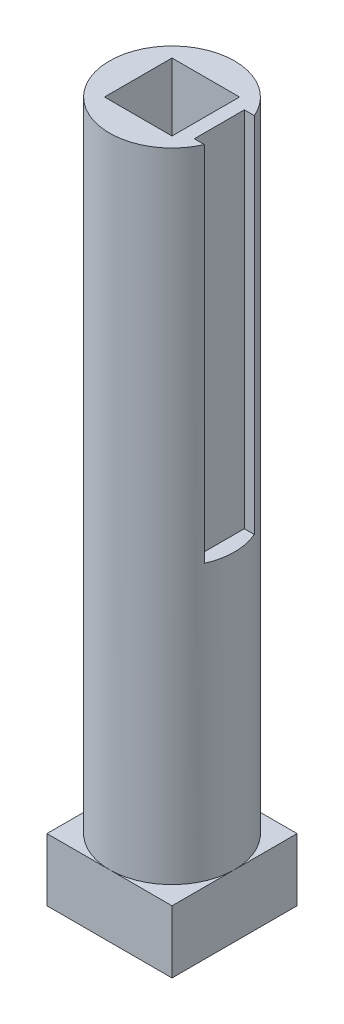
ISO-10303-21;
HEADER;
FILE_DESCRIPTION(('STEP AP214'),'2;1');
FILE_NAME('part.step','',(''),(''),'','','');
FILE_SCHEMA(('AUTOMOTIVE_DESIGN { 1 0 10303 214 1 1 1 1 }'));
ENDSEC;
DATA;
#1=APPLICATION_CONTEXT('core data for automotive mechanical design processes');
#2=APPLICATION_PROTOCOL_DEFINITION('international standard','automotive_design',2000,#1);
#3=PRODUCT_CONTEXT('',#1,'mechanical');
#4=PRODUCT('Part','Part','',(#3));
#5=PRODUCT_RELATED_PRODUCT_CATEGORY('part','',(#4));
#6=PRODUCT_DEFINITION_FORMATION('','',#4);
#7=PRODUCT_DEFINITION_CONTEXT('part definition',#1,'design');
#8=PRODUCT_DEFINITION('design','',#6,#7);
#9=PRODUCT_DEFINITION_SHAPE('','',#8);
#10=(LENGTH_UNIT() NAMED_UNIT(*) SI_UNIT(.MILLI.,.METRE.));
#11=(NAMED_UNIT(*) PLANE_ANGLE_UNIT() SI_UNIT($,.RADIAN.));
#12=(NAMED_UNIT(*) SI_UNIT($,.STERADIAN.) SOLID_ANGLE_UNIT());
#13=UNCERTAINTY_MEASURE_WITH_UNIT(LENGTH_MEASURE(1.E-05),#10,'distance_accuracy_value','');
#14=(GEOMETRIC_REPRESENTATION_CONTEXT(3) GLOBAL_UNCERTAINTY_ASSIGNED_CONTEXT((#13)) GLOBAL_UNIT_ASSIGNED_CONTEXT((#10,
#11,#12)) REPRESENTATION_CONTEXT('',''));
#15=CARTESIAN_POINT('',(0.,0.,0.));
#16=DIRECTION('',(0.,0.,1.));
#17=DIRECTION('',(1.,0.,0.));
#18=AXIS2_PLACEMENT_3D('',#15,#16,#17);
#19=CARTESIAN_POINT('',(-4.61642628509379,2.24309980317992,14.5677396821385));
#20=DIRECTION('',(0.,-1.,0.));
#21=DIRECTION('',(0.,0.,-1.));
#22=AXIS2_PLACEMENT_3D('',#19,#20,#21);
#23=CYLINDRICAL_SURFACE('',#22,2.5);
#24=CARTESIAN_POINT('',(-4.61642628509379,-15.3569001968201,14.5677396821385));
#25=DIRECTION('',(0.,1.,0.));
#26=DIRECTION('',(0.,0.,1.));
#27=AXIS2_PLACEMENT_3D('',#24,#25,#26);
#28=CIRCLE('',#27,2.5);
#29=CARTESIAN_POINT('',(-4.61642628509379,-15.3569001968201,17.0677396821385));
#30=VERTEX_POINT('',#29);
#31=CARTESIAN_POINT('',(-2.11642628509379,-15.3569001968201,14.5677396821385));
#32=VERTEX_POINT('',#31);
#33=EDGE_CURVE('E52',#30,#32,#28,.T.);
#34=ORIENTED_EDGE('',*,*,#33,.T.);
#35=CARTESIAN_POINT('',(-4.61642628509379,-15.3569001968201,12.0677396821385));
#36=VERTEX_POINT('',#35);
#37=EDGE_CURVE('E11',#32,#36,#28,.T.);
#38=ORIENTED_EDGE('',*,*,#37,.T.);
#39=CARTESIAN_POINT('',(-7.11642628509379,-15.3569001968201,14.5677396821385));
#40=VERTEX_POINT('',#39);
#41=EDGE_CURVE('E50',#36,#40,#28,.T.);
#42=ORIENTED_EDGE('',*,*,#41,.T.);
#43=EDGE_CURVE('E214',#40,#30,#28,.T.);
#44=ORIENTED_EDGE('',*,*,#43,.T.);
#45=EDGE_LOOP('',(#34,#38,#42,#44));
#46=FACE_BOUND('',#45,.T.);
#47=DIRECTION('',(0.,1.,0.));
#48=VECTOR('',#47,1.);
#49=CARTESIAN_POINT('',(-2.32513843761587,-4.35690019682008,15.5677396821385));
#50=LINE('',#49,#48);
#51=CARTESIAN_POINT('',(-2.32513843761587,-4.35690019682008,15.5677396821385));
#52=VERTEX_POINT('',#51);
#53=CARTESIAN_POINT('',(-2.32513843761587,10.1430998031799,15.5677396821385));
#54=VERTEX_POINT('',#53);
#55=EDGE_CURVE('E145',#52,#54,#50,.T.);
#56=ORIENTED_EDGE('',*,*,#55,.T.);
#57=CARTESIAN_POINT('',(-4.61642628509379,10.1430998031799,14.5677396821385));
#58=DIRECTION('',(0.,1.,0.));
#59=DIRECTION('',(0.,0.,1.));
#60=AXIS2_PLACEMENT_3D('',#57,#58,#59);
#61=CIRCLE('',#60,2.5);
#62=CARTESIAN_POINT('',(-2.32513843761587,10.1430998031799,13.5677396821385));
#63=VERTEX_POINT('',#62);
#64=EDGE_CURVE('E205',#63,#54,#61,.T.);
#65=ORIENTED_EDGE('',*,*,#64,.F.);
#66=DIRECTION('',(0.,1.,0.));
#67=VECTOR('',#66,1.);
#68=CARTESIAN_POINT('',(-2.32513843761587,-4.35690019682008,13.5677396821385));
#69=LINE('',#68,#67);
#70=CARTESIAN_POINT('',(-2.32513843761587,-4.35690019682008,13.5677396821385));
#71=VERTEX_POINT('',#70);
#72=EDGE_CURVE('E59',#71,#63,#69,.T.);
#73=ORIENTED_EDGE('',*,*,#72,.F.);
#74=CARTESIAN_POINT('',(-4.61642628509379,-4.35690019682008,14.5677396821385));
#75=DIRECTION('',(0.,1.,0.));
#76=DIRECTION('',(0.,0.,1.));
#77=AXIS2_PLACEMENT_3D('',#74,#75,#76);
#78=CIRCLE('',#77,2.5);
#79=EDGE_CURVE('E163',#52,#71,#78,.T.);
#80=ORIENTED_EDGE('',*,*,#79,.F.);
#81=EDGE_LOOP('',(#56,#65,#73,#80));
#82=FACE_BOUND('',#81,.T.);
#83=ADVANCED_FACE('F41',(#46,#82),#23,.T.);
#84=CARTESIAN_POINT('',(-4.61642628509379,10.1430998031799,14.5677396821385));
#85=DIRECTION('',(0.,1.,0.));
#86=DIRECTION('',(0.,0.,1.));
#87=AXIS2_PLACEMENT_3D('',#84,#85,#86);
#88=PLANE('',#87);
#89=DIRECTION('',(1.,0.,0.));
#90=VECTOR('',#89,1.);
#91=CARTESIAN_POINT('',(0.,10.1430998031799,15.9177396821385));
#92=LINE('',#91,#90);
#93=CARTESIAN_POINT('',(-5.96642628509379,10.1430998031799,15.9177396821385));
#94=VERTEX_POINT('',#93);
#95=CARTESIAN_POINT('',(-3.26642628509379,10.1430998031799,15.9177396821385));
#96=VERTEX_POINT('',#95);
#97=EDGE_CURVE('E67',#94,#96,#92,.T.);
#98=ORIENTED_EDGE('',*,*,#97,.F.);
#99=DIRECTION('',(0.,0.,-1.));
#100=VECTOR('',#99,1.);
#101=CARTESIAN_POINT('',(-5.96642628509379,10.1430998031799,0.));
#102=LINE('',#101,#100);
#103=CARTESIAN_POINT('',(-5.96642628509379,10.1430998031799,13.2177396821385));
#104=VERTEX_POINT('',#103);
#105=EDGE_CURVE('E186',#94,#104,#102,.T.);
#106=ORIENTED_EDGE('',*,*,#105,.T.);
#107=DIRECTION('',(1.,0.,0.));
#108=VECTOR('',#107,1.);
#109=CARTESIAN_POINT('',(0.,10.1430998031799,13.2177396821385));
#110=LINE('',#109,#108);
#111=CARTESIAN_POINT('',(-3.26642628509379,10.1430998031799,13.2177396821385));
#112=VERTEX_POINT('',#111);
#113=EDGE_CURVE('E198',#104,#112,#110,.T.);
#114=ORIENTED_EDGE('',*,*,#113,.T.);
#115=DIRECTION('',(0.,0.,-1.));
#116=VECTOR('',#115,1.);
#117=CARTESIAN_POINT('',(-3.26642628509379,10.1430998031799,0.));
#118=LINE('',#117,#116);
#119=EDGE_CURVE('E195',#96,#112,#118,.T.);
#120=ORIENTED_EDGE('',*,*,#119,.F.);
#121=EDGE_LOOP('',(#98,#106,#114,#120));
#122=FACE_BOUND('',#121,.T.);
#123=ORIENTED_EDGE('',*,*,#64,.T.);
#124=DIRECTION('',(-1.,0.,0.));
#125=VECTOR('',#124,1.);
#126=CARTESIAN_POINT('',(0.,10.1430998031799,15.5677396821385));
#127=LINE('',#126,#125);
#128=CARTESIAN_POINT('',(-2.72513843761587,10.1430998031799,15.5677396821385));
#129=VERTEX_POINT('',#128);
#130=EDGE_CURVE('E151',#54,#129,#127,.T.);
#131=ORIENTED_EDGE('',*,*,#130,.T.);
#132=DIRECTION('',(0.,0.,1.));
#133=VECTOR('',#132,1.);
#134=CARTESIAN_POINT('',(-2.72513843761587,10.1430998031799,0.));
#135=LINE('',#134,#133);
#136=CARTESIAN_POINT('',(-2.72513843761587,10.1430998031799,13.5677396821385));
#137=VERTEX_POINT('',#136);
#138=EDGE_CURVE('E165',#137,#129,#135,.T.);
#139=ORIENTED_EDGE('',*,*,#138,.F.);
#140=DIRECTION('',(-1.,0.,0.));
#141=VECTOR('',#140,1.);
#142=CARTESIAN_POINT('',(0.,10.1430998031799,13.5677396821385));
#143=LINE('',#142,#141);
#144=EDGE_CURVE('E173',#63,#137,#143,.T.);
#145=ORIENTED_EDGE('',*,*,#144,.F.);
#146=EDGE_LOOP('',(#123,#131,#139,#145));
#147=FACE_BOUND('',#146,.T.);
#148=ADVANCED_FACE('F294',(#122,#147),#88,.T.);
#149=CARTESIAN_POINT('',(-4.61642628509379,-15.3569001968201,14.5677396821385));
#150=DIRECTION('',(0.,1.,0.));
#151=DIRECTION('',(0.,0.,1.));
#152=AXIS2_PLACEMENT_3D('',#149,#150,#151);
#153=PLANE('',#152);
#154=ORIENTED_EDGE('',*,*,#33,.F.);
#155=DIRECTION('',(1.,0.,0.));
#156=VECTOR('',#155,1.);
#157=CARTESIAN_POINT('',(-7.11642628509379,-15.3569001968201,17.0677396821385));
#158=LINE('',#157,#156);
#159=CARTESIAN_POINT('',(-2.11642628509379,-15.3569001968201,17.0677396821385));
#160=VERTEX_POINT('',#159);
#161=EDGE_CURVE('E218',#30,#160,#158,.T.);
#162=ORIENTED_EDGE('',*,*,#161,.T.);
#163=DIRECTION('',(0.,0.,-1.));
#164=VECTOR('',#163,1.);
#165=CARTESIAN_POINT('',(-2.11642628509379,-15.3569001968201,17.0677396821385));
#166=LINE('',#165,#164);
#167=EDGE_CURVE('E219',#160,#32,#166,.T.);
#168=ORIENTED_EDGE('',*,*,#167,.T.);
#169=EDGE_LOOP('',(#154,#162,#168));
#170=FACE_BOUND('',#169,.T.);
#171=ADVANCED_FACE('F277',(#170),#153,.T.);
#172=ORIENTED_EDGE('',*,*,#37,.F.);
#173=CARTESIAN_POINT('',(-2.11642628509379,-15.3569001968201,12.0677396821385));
#174=VERTEX_POINT('',#173);
#175=EDGE_CURVE('E217',#32,#174,#166,.T.);
#176=ORIENTED_EDGE('',*,*,#175,.T.);
#177=DIRECTION('',(1.,0.,0.));
#178=VECTOR('',#177,1.);
#179=CARTESIAN_POINT('',(-7.11642628509379,-15.3569001968201,12.0677396821385));
#180=LINE('',#179,#178);
#181=EDGE_CURVE('E222',#36,#174,#180,.T.);
#182=ORIENTED_EDGE('',*,*,#181,.F.);
#183=EDGE_LOOP('',(#172,#176,#182));
#184=FACE_BOUND('',#183,.T.);
#185=ADVANCED_FACE('F262',(#184),#153,.T.);
#186=ORIENTED_EDGE('',*,*,#41,.F.);
#187=CARTESIAN_POINT('',(-7.11642628509379,-15.3569001968201,12.0677396821385));
#188=VERTEX_POINT('',#187);
#189=EDGE_CURVE('E223',#188,#36,#180,.T.);
#190=ORIENTED_EDGE('',*,*,#189,.F.);
#191=DIRECTION('',(0.,0.,-1.));
#192=VECTOR('',#191,1.);
#193=CARTESIAN_POINT('',(-7.11642628509379,-15.3569001968201,17.0677396821385));
#194=LINE('',#193,#192);
#195=EDGE_CURVE('E226',#40,#188,#194,.T.);
#196=ORIENTED_EDGE('',*,*,#195,.F.);
#197=EDGE_LOOP('',(#186,#190,#196));
#198=FACE_BOUND('',#197,.T.);
#199=ADVANCED_FACE('F259',(#198),#153,.T.);
#200=CARTESIAN_POINT('',(-7.11642628509379,-15.3569001968201,17.0677396821385));
#201=DIRECTION('',(0.,0.,-1.));
#202=DIRECTION('',(-1.,0.,0.));
#203=AXIS2_PLACEMENT_3D('',#200,#201,#202);
#204=PLANE('',#203);
#205=DIRECTION('',(1.,0.,0.));
#206=VECTOR('',#205,1.);
#207=CARTESIAN_POINT('',(-7.11642628509379,-17.8569001968201,17.0677396821385));
#208=LINE('',#207,#206);
#209=CARTESIAN_POINT('',(-7.11642628509379,-17.8569001968201,17.0677396821385));
#210=VERTEX_POINT('',#209);
#211=CARTESIAN_POINT('',(-2.11642628509379,-17.8569001968201,17.0677396821385));
#212=VERTEX_POINT('',#211);
#213=EDGE_CURVE('E213',#210,#212,#208,.T.);
#214=ORIENTED_EDGE('',*,*,#213,.T.);
#215=DIRECTION('',(0.,-1.,0.));
#216=VECTOR('',#215,1.);
#217=CARTESIAN_POINT('',(-2.11642628509379,-15.3569001968201,17.0677396821385));
#218=LINE('',#217,#216);
#219=EDGE_CURVE('E45',#160,#212,#218,.T.);
#220=ORIENTED_EDGE('',*,*,#219,.F.);
#221=ORIENTED_EDGE('',*,*,#161,.F.);
#222=CARTESIAN_POINT('',(-7.11642628509379,-15.3569001968201,17.0677396821385));
#223=VERTEX_POINT('',#222);
#224=EDGE_CURVE('E215',#223,#30,#158,.T.);
#225=ORIENTED_EDGE('',*,*,#224,.F.);
#226=DIRECTION('',(0.,-1.,0.));
#227=VECTOR('',#226,1.);
#228=CARTESIAN_POINT('',(-7.11642628509379,-15.3569001968201,17.0677396821385));
#229=LINE('',#228,#227);
#230=EDGE_CURVE('E230',#223,#210,#229,.T.);
#231=ORIENTED_EDGE('',*,*,#230,.T.);
#232=EDGE_LOOP('',(#214,#220,#221,#225,#231));
#233=FACE_BOUND('',#232,.T.);
#234=ADVANCED_FACE('F43',(#233),#204,.F.);
#235=CARTESIAN_POINT('',(-2.11642628509379,-15.3569001968201,17.0677396821385));
#236=DIRECTION('',(-1.,0.,0.));
#237=DIRECTION('',(0.,0.,1.));
#238=AXIS2_PLACEMENT_3D('',#235,#236,#237);
#239=PLANE('',#238);
#240=DIRECTION('',(0.,0.,-1.));
#241=VECTOR('',#240,1.);
#242=CARTESIAN_POINT('',(-2.11642628509379,-17.8569001968201,17.0677396821385));
#243=LINE('',#242,#241);
#244=CARTESIAN_POINT('',(-2.11642628509379,-17.8569001968201,12.0677396821385));
#245=VERTEX_POINT('',#244);
#246=EDGE_CURVE('E233',#212,#245,#243,.T.);
#247=ORIENTED_EDGE('',*,*,#246,.T.);
#248=DIRECTION('',(0.,-1.,0.));
#249=VECTOR('',#248,1.);
#250=CARTESIAN_POINT('',(-2.11642628509379,-15.3569001968201,12.0677396821385));
#251=LINE('',#250,#249);
#252=EDGE_CURVE('E244',#174,#245,#251,.T.);
#253=ORIENTED_EDGE('',*,*,#252,.F.);
#254=ORIENTED_EDGE('',*,*,#175,.F.);
#255=ORIENTED_EDGE('',*,*,#167,.F.);
#256=ORIENTED_EDGE('',*,*,#219,.T.);
#257=EDGE_LOOP('',(#247,#253,#254,#255,#256));
#258=FACE_BOUND('',#257,.T.);
#259=ADVANCED_FACE('F278',(#258),#239,.F.);
#260=CARTESIAN_POINT('',(-7.11642628509379,-15.3569001968201,12.0677396821385));
#261=DIRECTION('',(0.,0.,-1.));
#262=DIRECTION('',(-1.,0.,0.));
#263=AXIS2_PLACEMENT_3D('',#260,#261,#262);
#264=PLANE('',#263);
#265=DIRECTION('',(1.,0.,0.));
#266=VECTOR('',#265,1.);
#267=CARTESIAN_POINT('',(-7.11642628509379,-17.8569001968201,12.0677396821385));
#268=LINE('',#267,#266);
#269=CARTESIAN_POINT('',(-7.11642628509379,-17.8569001968201,12.0677396821385));
#270=VERTEX_POINT('',#269);
#271=EDGE_CURVE('E236',#270,#245,#268,.T.);
#272=ORIENTED_EDGE('',*,*,#271,.F.);
#273=DIRECTION('',(0.,-1.,0.));
#274=VECTOR('',#273,1.);
#275=CARTESIAN_POINT('',(-7.11642628509379,-15.3569001968201,12.0677396821385));
#276=LINE('',#275,#274);
#277=EDGE_CURVE('E243',#188,#270,#276,.T.);
#278=ORIENTED_EDGE('',*,*,#277,.F.);
#279=ORIENTED_EDGE('',*,*,#189,.T.);
#280=ORIENTED_EDGE('',*,*,#181,.T.);
#281=ORIENTED_EDGE('',*,*,#252,.T.);
#282=EDGE_LOOP('',(#272,#278,#279,#280,#281));
#283=FACE_BOUND('',#282,.T.);
#284=ADVANCED_FACE('F265',(#283),#264,.T.);
#285=CARTESIAN_POINT('',(-7.11642628509379,-15.3569001968201,17.0677396821385));
#286=DIRECTION('',(-1.,0.,0.));
#287=DIRECTION('',(0.,0.,1.));
#288=AXIS2_PLACEMENT_3D('',#285,#286,#287);
#289=PLANE('',#288);
#290=DIRECTION('',(0.,0.,-1.));
#291=VECTOR('',#290,1.);
#292=CARTESIAN_POINT('',(-7.11642628509379,-17.8569001968201,17.0677396821385));
#293=LINE('',#292,#291);
#294=EDGE_CURVE('E239',#210,#270,#293,.T.);
#295=ORIENTED_EDGE('',*,*,#294,.F.);
#296=ORIENTED_EDGE('',*,*,#230,.F.);
#297=EDGE_CURVE('E227',#223,#40,#194,.T.);
#298=ORIENTED_EDGE('',*,*,#297,.T.);
#299=ORIENTED_EDGE('',*,*,#195,.T.);
#300=ORIENTED_EDGE('',*,*,#277,.T.);
#301=EDGE_LOOP('',(#295,#296,#298,#299,#300));
#302=FACE_BOUND('',#301,.T.);
#303=ADVANCED_FACE('F268',(#302),#289,.T.);
#304=ORIENTED_EDGE('',*,*,#43,.F.);
#305=ORIENTED_EDGE('',*,*,#297,.F.);
#306=ORIENTED_EDGE('',*,*,#224,.T.);
#307=EDGE_LOOP('',(#304,#305,#306));
#308=FACE_BOUND('',#307,.T.);
#309=ADVANCED_FACE('F272',(#308),#153,.T.);
#310=CARTESIAN_POINT('',(-4.61642628509379,-17.8569001968201,14.5677396821385));
#311=DIRECTION('',(0.,1.,0.));
#312=DIRECTION('',(0.,0.,1.));
#313=AXIS2_PLACEMENT_3D('',#310,#311,#312);
#314=PLANE('',#313);
#315=ORIENTED_EDGE('',*,*,#213,.F.);
#316=ORIENTED_EDGE('',*,*,#294,.T.);
#317=ORIENTED_EDGE('',*,*,#271,.T.);
#318=ORIENTED_EDGE('',*,*,#246,.F.);
#319=EDGE_LOOP('',(#315,#316,#317,#318));
#320=FACE_BOUND('',#319,.T.);
#321=ADVANCED_FACE('F281',(#320),#314,.F.);
#322=CARTESIAN_POINT('',(0.,7.14309980317992,15.9177396821385));
#323=DIRECTION('',(0.,0.,1.));
#324=DIRECTION('',(1.,0.,0.));
#325=AXIS2_PLACEMENT_3D('',#322,#323,#324);
#326=PLANE('',#325);
#327=ORIENTED_EDGE('',*,*,#97,.T.);
#328=DIRECTION('',(0.,1.,0.));
#329=VECTOR('',#328,1.);
#330=CARTESIAN_POINT('',(-3.26642628509379,7.14309980317992,15.9177396821385));
#331=LINE('',#330,#329);
#332=CARTESIAN_POINT('',(-3.26642628509379,7.14309980317992,15.9177396821385));
#333=VERTEX_POINT('',#332);
#334=EDGE_CURVE('E193',#333,#96,#331,.T.);
#335=ORIENTED_EDGE('',*,*,#334,.F.);
#336=DIRECTION('',(1.,0.,0.));
#337=VECTOR('',#336,1.);
#338=CARTESIAN_POINT('',(0.,7.14309980317992,15.9177396821385));
#339=LINE('',#338,#337);
#340=CARTESIAN_POINT('',(-5.96642628509379,7.14309980317992,15.9177396821385));
#341=VERTEX_POINT('',#340);
#342=EDGE_CURVE('E182',#341,#333,#339,.T.);
#343=ORIENTED_EDGE('',*,*,#342,.F.);
#344=DIRECTION('',(0.,1.,0.));
#345=VECTOR('',#344,1.);
#346=CARTESIAN_POINT('',(-5.96642628509379,7.14309980317992,15.9177396821385));
#347=LINE('',#346,#345);
#348=EDGE_CURVE('E203',#341,#94,#347,.T.);
#349=ORIENTED_EDGE('',*,*,#348,.T.);
#350=EDGE_LOOP('',(#327,#335,#343,#349));
#351=FACE_BOUND('',#350,.T.);
#352=ADVANCED_FACE('F283',(#351),#326,.F.);
#353=CARTESIAN_POINT('',(-5.96642628509379,7.14309980317992,0.));
#354=DIRECTION('',(1.,0.,0.));
#355=DIRECTION('',(0.,0.,-1.));
#356=AXIS2_PLACEMENT_3D('',#353,#354,#355);
#357=PLANE('',#356);
#358=ORIENTED_EDGE('',*,*,#105,.F.);
#359=ORIENTED_EDGE('',*,*,#348,.F.);
#360=DIRECTION('',(0.,0.,-1.));
#361=VECTOR('',#360,1.);
#362=CARTESIAN_POINT('',(-5.96642628509379,7.14309980317992,0.));
#363=LINE('',#362,#361);
#364=CARTESIAN_POINT('',(-5.96642628509379,7.14309980317992,13.2177396821385));
#365=VERTEX_POINT('',#364);
#366=EDGE_CURVE('E191',#341,#365,#363,.T.);
#367=ORIENTED_EDGE('',*,*,#366,.T.);
#368=DIRECTION('',(0.,1.,0.));
#369=VECTOR('',#368,1.);
#370=CARTESIAN_POINT('',(-5.96642628509379,7.14309980317992,13.2177396821385));
#371=LINE('',#370,#369);
#372=EDGE_CURVE('E206',#365,#104,#371,.T.);
#373=ORIENTED_EDGE('',*,*,#372,.T.);
#374=EDGE_LOOP('',(#358,#359,#367,#373));
#375=FACE_BOUND('',#374,.T.);
#376=ADVANCED_FACE('F289',(#375),#357,.T.);
#377=CARTESIAN_POINT('',(0.,7.14309980317992,13.2177396821385));
#378=DIRECTION('',(0.,0.,1.));
#379=DIRECTION('',(1.,0.,0.));
#380=AXIS2_PLACEMENT_3D('',#377,#378,#379);
#381=PLANE('',#380);
#382=ORIENTED_EDGE('',*,*,#113,.F.);
#383=ORIENTED_EDGE('',*,*,#372,.F.);
#384=DIRECTION('',(1.,0.,0.));
#385=VECTOR('',#384,1.);
#386=CARTESIAN_POINT('',(0.,7.14309980317992,13.2177396821385));
#387=LINE('',#386,#385);
#388=CARTESIAN_POINT('',(-3.26642628509379,7.14309980317992,13.2177396821385));
#389=VERTEX_POINT('',#388);
#390=EDGE_CURVE('E189',#365,#389,#387,.T.);
#391=ORIENTED_EDGE('',*,*,#390,.T.);
#392=DIRECTION('',(0.,1.,0.));
#393=VECTOR('',#392,1.);
#394=CARTESIAN_POINT('',(-3.26642628509379,7.14309980317992,13.2177396821385));
#395=LINE('',#394,#393);
#396=EDGE_CURVE('E208',#389,#112,#395,.T.);
#397=ORIENTED_EDGE('',*,*,#396,.T.);
#398=EDGE_LOOP('',(#382,#383,#391,#397));
#399=FACE_BOUND('',#398,.T.);
#400=ADVANCED_FACE('F306',(#399),#381,.T.);
#401=CARTESIAN_POINT('',(-3.26642628509379,7.14309980317992,0.));
#402=DIRECTION('',(1.,0.,0.));
#403=DIRECTION('',(0.,0.,-1.));
#404=AXIS2_PLACEMENT_3D('',#401,#402,#403);
#405=PLANE('',#404);
#406=ORIENTED_EDGE('',*,*,#119,.T.);
#407=ORIENTED_EDGE('',*,*,#396,.F.);
#408=DIRECTION('',(0.,0.,-1.));
#409=VECTOR('',#408,1.);
#410=CARTESIAN_POINT('',(-3.26642628509379,7.14309980317992,0.));
#411=LINE('',#410,#409);
#412=EDGE_CURVE('E185',#333,#389,#411,.T.);
#413=ORIENTED_EDGE('',*,*,#412,.F.);
#414=ORIENTED_EDGE('',*,*,#334,.T.);
#415=EDGE_LOOP('',(#406,#407,#413,#414));
#416=FACE_BOUND('',#415,.T.);
#417=ADVANCED_FACE('F302',(#416),#405,.F.);
#418=CARTESIAN_POINT('',(0.,7.14309980317992,0.));
#419=DIRECTION('',(0.,1.,0.));
#420=DIRECTION('',(0.,0.,1.));
#421=AXIS2_PLACEMENT_3D('',#418,#419,#420);
#422=PLANE('',#421);
#423=ORIENTED_EDGE('',*,*,#342,.T.);
#424=ORIENTED_EDGE('',*,*,#412,.T.);
#425=ORIENTED_EDGE('',*,*,#390,.F.);
#426=ORIENTED_EDGE('',*,*,#366,.F.);
#427=EDGE_LOOP('',(#423,#424,#425,#426));
#428=FACE_BOUND('',#427,.T.);
#429=ADVANCED_FACE('F305',(#428),#422,.T.);
#430=CARTESIAN_POINT('',(0.,-4.35690019682008,15.5677396821385));
#431=DIRECTION('',(0.,0.,-1.));
#432=DIRECTION('',(-1.,0.,0.));
#433=AXIS2_PLACEMENT_3D('',#430,#431,#432);
#434=PLANE('',#433);
#435=ORIENTED_EDGE('',*,*,#130,.F.);
#436=ORIENTED_EDGE('',*,*,#55,.F.);
#437=DIRECTION('',(-1.,0.,0.));
#438=VECTOR('',#437,1.);
#439=CARTESIAN_POINT('',(0.,-4.35690019682008,15.5677396821385));
#440=LINE('',#439,#438);
#441=CARTESIAN_POINT('',(-2.72513843761587,-4.35690019682008,15.5677396821385));
#442=VERTEX_POINT('',#441);
#443=EDGE_CURVE('E148',#52,#442,#440,.T.);
#444=ORIENTED_EDGE('',*,*,#443,.T.);
#445=DIRECTION('',(0.,1.,0.));
#446=VECTOR('',#445,1.);
#447=CARTESIAN_POINT('',(-2.72513843761587,-4.35690019682008,15.5677396821385));
#448=LINE('',#447,#446);
#449=EDGE_CURVE('E177',#442,#129,#448,.T.);
#450=ORIENTED_EDGE('',*,*,#449,.T.);
#451=EDGE_LOOP('',(#435,#436,#444,#450));
#452=FACE_BOUND('',#451,.T.);
#453=ADVANCED_FACE('F147',(#452),#434,.T.);
#454=CARTESIAN_POINT('',(-2.72513843761587,-4.35690019682008,0.));
#455=DIRECTION('',(-1.,0.,0.));
#456=DIRECTION('',(0.,0.,1.));
#457=AXIS2_PLACEMENT_3D('',#454,#455,#456);
#458=PLANE('',#457);
#459=ORIENTED_EDGE('',*,*,#138,.T.);
#460=ORIENTED_EDGE('',*,*,#449,.F.);
#461=DIRECTION('',(0.,0.,1.));
#462=VECTOR('',#461,1.);
#463=CARTESIAN_POINT('',(-2.72513843761587,-4.35690019682008,0.));
#464=LINE('',#463,#462);
#465=CARTESIAN_POINT('',(-2.72513843761587,-4.35690019682008,13.5677396821385));
#466=VERTEX_POINT('',#465);
#467=EDGE_CURVE('E156',#466,#442,#464,.T.);
#468=ORIENTED_EDGE('',*,*,#467,.F.);
#469=DIRECTION('',(0.,1.,0.));
#470=VECTOR('',#469,1.);
#471=CARTESIAN_POINT('',(-2.72513843761587,-4.35690019682008,13.5677396821385));
#472=LINE('',#471,#470);
#473=EDGE_CURVE('E179',#466,#137,#472,.T.);
#474=ORIENTED_EDGE('',*,*,#473,.T.);
#475=EDGE_LOOP('',(#459,#460,#468,#474));
#476=FACE_BOUND('',#475,.T.);
#477=ADVANCED_FACE('F319',(#476),#458,.F.);
#478=CARTESIAN_POINT('',(0.,-4.35690019682008,13.5677396821385));
#479=DIRECTION('',(0.,0.,-1.));
#480=DIRECTION('',(-1.,0.,0.));
#481=AXIS2_PLACEMENT_3D('',#478,#479,#480);
#482=PLANE('',#481);
#483=ORIENTED_EDGE('',*,*,#144,.T.);
#484=ORIENTED_EDGE('',*,*,#473,.F.);
#485=DIRECTION('',(-1.,0.,0.));
#486=VECTOR('',#485,1.);
#487=CARTESIAN_POINT('',(0.,-4.35690019682008,13.5677396821385));
#488=LINE('',#487,#486);
#489=EDGE_CURVE('E167',#71,#466,#488,.T.);
#490=ORIENTED_EDGE('',*,*,#489,.F.);
#491=ORIENTED_EDGE('',*,*,#72,.T.);
#492=EDGE_LOOP('',(#483,#484,#490,#491));
#493=FACE_BOUND('',#492,.T.);
#494=ADVANCED_FACE('F320',(#493),#482,.F.);
#495=CARTESIAN_POINT('',(0.,-4.35690019682008,0.));
#496=DIRECTION('',(0.,1.,0.));
#497=DIRECTION('',(0.,0.,1.));
#498=AXIS2_PLACEMENT_3D('',#495,#496,#497);
#499=PLANE('',#498);
#500=ORIENTED_EDGE('',*,*,#443,.F.);
#501=ORIENTED_EDGE('',*,*,#79,.T.);
#502=ORIENTED_EDGE('',*,*,#489,.T.);
#503=ORIENTED_EDGE('',*,*,#467,.T.);
#504=EDGE_LOOP('',(#500,#501,#502,#503));
#505=FACE_BOUND('',#504,.T.);
#506=ADVANCED_FACE('F161',(#505),#499,.T.);
#507=CLOSED_SHELL('',(#83,#148,#171,#185,#199,#234,#259,#284,#303,#309,#321,#352,#376,#400,#417,
#429,#453,#477,#494,#506));
#508=MANIFOLD_SOLID_BREP('B2',#507);
#509=ADVANCED_BREP_SHAPE_REPRESENTATION('',(#18,#508),#14);
#510=SHAPE_DEFINITION_REPRESENTATION(#9,#509);
ENDSEC;
END-ISO-10303-21;
